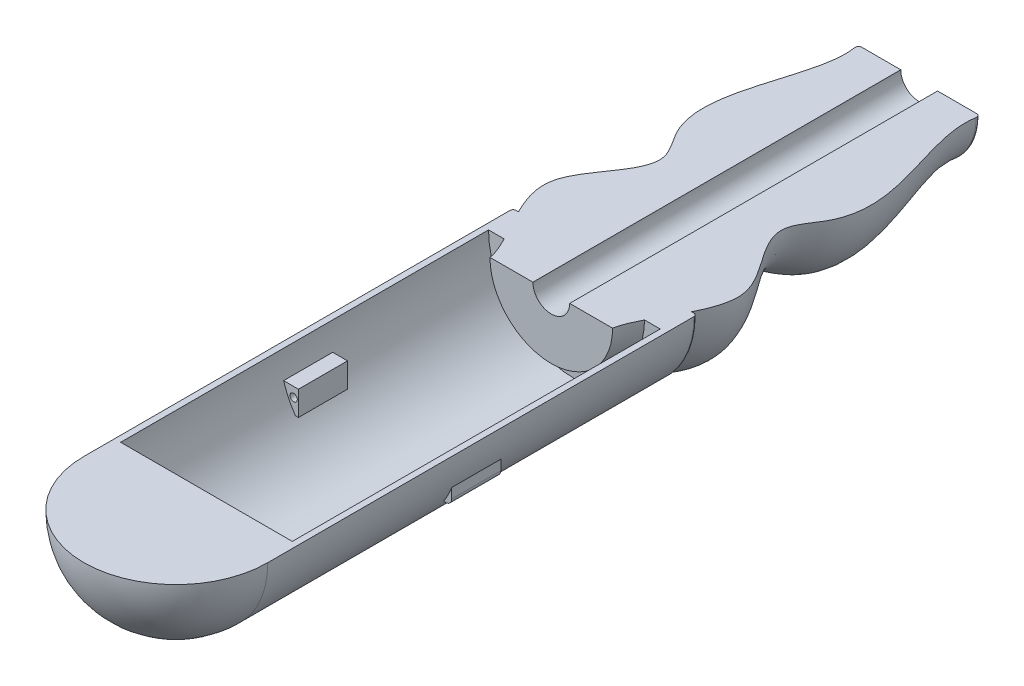
ISO-10303-21;
HEADER;
FILE_DESCRIPTION(('STEP AP214'),'2;1');
FILE_NAME('part.step','',(''),(''),'','','');
FILE_SCHEMA(('AUTOMOTIVE_DESIGN { 1 0 10303 214 1 1 1 1 }'));
ENDSEC;
DATA;
#1=APPLICATION_CONTEXT('core data for automotive mechanical design processes');
#2=APPLICATION_PROTOCOL_DEFINITION('international standard','automotive_design',2000,#1);
#3=PRODUCT_CONTEXT('',#1,'mechanical');
#4=PRODUCT('Part','Part','',(#3));
#5=PRODUCT_RELATED_PRODUCT_CATEGORY('part','',(#4));
#6=PRODUCT_DEFINITION_FORMATION('','',#4);
#7=PRODUCT_DEFINITION_CONTEXT('part definition',#1,'design');
#8=PRODUCT_DEFINITION('design','',#6,#7);
#9=PRODUCT_DEFINITION_SHAPE('','',#8);
#10=(LENGTH_UNIT() NAMED_UNIT(*) SI_UNIT(.MILLI.,.METRE.));
#11=(NAMED_UNIT(*) PLANE_ANGLE_UNIT() SI_UNIT($,.RADIAN.));
#12=(NAMED_UNIT(*) SI_UNIT($,.STERADIAN.) SOLID_ANGLE_UNIT());
#13=UNCERTAINTY_MEASURE_WITH_UNIT(LENGTH_MEASURE(1.E-05),#10,'distance_accuracy_value','');
#14=(GEOMETRIC_REPRESENTATION_CONTEXT(3) GLOBAL_UNCERTAINTY_ASSIGNED_CONTEXT((#13)) GLOBAL_UNIT_ASSIGNED_CONTEXT((#10,
#11,#12)) REPRESENTATION_CONTEXT('',''));
#15=CARTESIAN_POINT('',(0.,0.,0.));
#16=DIRECTION('',(0.,0.,1.));
#17=DIRECTION('',(1.,0.,0.));
#18=AXIS2_PLACEMENT_3D('',#15,#16,#17);
#19=CARTESIAN_POINT('',(33.02,-17.78,0.));
#20=DIRECTION('',(0.,0.,-1.));
#21=DIRECTION('',(-1.,0.,0.));
#22=AXIS2_PLACEMENT_3D('',#19,#20,#21);
#23=CYLINDRICAL_SURFACE('',#22,2.54);
#24=DIRECTION('',(0.,0.,-1.));
#25=VECTOR('',#24,1.);
#26=CARTESIAN_POINT('',(35.56,-17.78,0.));
#27=LINE('',#26,#25);
#28=CARTESIAN_POINT('',(35.56,-17.78,99.06));
#29=VERTEX_POINT('',#28);
#30=CARTESIAN_POINT('',(35.56,-17.78,78.74));
#31=VERTEX_POINT('',#30);
#32=EDGE_CURVE('E443',#29,#31,#27,.T.);
#33=ORIENTED_EDGE('',*,*,#32,.F.);
#34=CARTESIAN_POINT('',(33.02,-17.78,99.06));
#35=DIRECTION('',(0.,0.,-1.));
#36=DIRECTION('',(-1.,0.,0.));
#37=AXIS2_PLACEMENT_3D('',#34,#35,#36);
#38=CIRCLE('',#37,2.54);
#39=CARTESIAN_POINT('',(33.02,-20.32,99.06));
#40=VERTEX_POINT('',#39);
#41=EDGE_CURVE('E41',#40,#29,#38,.F.);
#42=ORIENTED_EDGE('',*,*,#41,.F.);
#43=DIRECTION('',(0.,0.,-1.));
#44=VECTOR('',#43,1.);
#45=CARTESIAN_POINT('',(33.02,-20.32,78.74));
#46=LINE('',#45,#44);
#47=CARTESIAN_POINT('',(33.02,-20.32,78.74));
#48=VERTEX_POINT('',#47);
#49=EDGE_CURVE('E447',#48,#40,#46,.F.);
#50=ORIENTED_EDGE('',*,*,#49,.F.);
#51=CARTESIAN_POINT('',(33.02,-17.78,78.74));
#52=DIRECTION('',(0.,0.,1.));
#53=DIRECTION('',(1.,0.,0.));
#54=AXIS2_PLACEMENT_3D('',#51,#52,#53);
#55=CIRCLE('',#54,2.54);
#56=EDGE_CURVE('E11',#31,#48,#55,.F.);
#57=ORIENTED_EDGE('',*,*,#56,.F.);
#58=EDGE_LOOP('',(#33,#42,#50,#57));
#59=FACE_BOUND('',#58,.T.);
#60=ADVANCED_FACE('F33',(#59),#23,.T.);
#61=CARTESIAN_POINT('',(0.,0.,165.1));
#62=DIRECTION('',(0.,0.,-1.));
#63=DIRECTION('',(-1.,0.,0.));
#64=AXIS2_PLACEMENT_3D('',#61,#62,#63);
#65=CYLINDRICAL_SURFACE('',#64,35.56);
#66=CARTESIAN_POINT('',(0.,0.,99.06));
#67=DIRECTION('',(0.,0.,-1.));
#68=DIRECTION('',(-1.,0.,0.));
#69=AXIS2_PLACEMENT_3D('',#66,#67,#68);
#70=CIRCLE('',#69,35.56);
#71=CARTESIAN_POINT('',(-34.0776759770968,-10.16,99.06));
#72=VERTEX_POINT('',#71);
#73=CARTESIAN_POINT('',(-29.1823782444132,-20.32,99.06));
#74=VERTEX_POINT('',#73);
#75=EDGE_CURVE('E305',#72,#74,#70,.F.);
#76=ORIENTED_EDGE('',*,*,#75,.F.);
#77=DIRECTION('',(0.,0.,-1.));
#78=VECTOR('',#77,1.);
#79=CARTESIAN_POINT('',(-34.0776759770968,-10.16,165.1));
#80=LINE('',#79,#78);
#81=CARTESIAN_POINT('',(-34.0776759770968,-10.16,78.74));
#82=VERTEX_POINT('',#81);
#83=EDGE_CURVE('E794',#82,#72,#80,.F.);
#84=ORIENTED_EDGE('',*,*,#83,.F.);
#85=CARTESIAN_POINT('',(0.,0.,78.74));
#86=DIRECTION('',(0.,0.,1.));
#87=DIRECTION('',(1.,0.,0.));
#88=AXIS2_PLACEMENT_3D('',#85,#86,#87);
#89=CIRCLE('',#88,35.56);
#90=CARTESIAN_POINT('',(-29.1823782444132,-20.32,78.74));
#91=VERTEX_POINT('',#90);
#92=EDGE_CURVE('E299',#91,#82,#89,.F.);
#93=ORIENTED_EDGE('',*,*,#92,.F.);
#94=DIRECTION('',(0.,0.,-1.));
#95=VECTOR('',#94,1.);
#96=CARTESIAN_POINT('',(-29.1823782444132,-20.32,165.1));
#97=LINE('',#96,#95);
#98=EDGE_CURVE('E302',#74,#91,#97,.T.);
#99=ORIENTED_EDGE('',*,*,#98,.F.);
#100=EDGE_LOOP('',(#76,#84,#93,#99));
#101=FACE_BOUND('',#100,.T.);
#102=DIRECTION('',(0.,0.,-1.));
#103=VECTOR('',#102,1.);
#104=CARTESIAN_POINT('',(35.56,0.,165.1));
#105=LINE('',#104,#103);
#106=CARTESIAN_POINT('',(35.56,0.,12.7));
#107=VERTEX_POINT('',#106);
#108=CARTESIAN_POINT('',(35.56,0.,165.1));
#109=VERTEX_POINT('',#108);
#110=EDGE_CURVE('E354',#107,#109,#105,.F.);
#111=ORIENTED_EDGE('',*,*,#110,.F.);
#112=CARTESIAN_POINT('',(0.,0.,12.7));
#113=DIRECTION('',(0.,0.,-1.));
#114=DIRECTION('',(-1.,0.,0.));
#115=AXIS2_PLACEMENT_3D('',#112,#113,#114);
#116=CIRCLE('',#115,35.56);
#117=CARTESIAN_POINT('',(-35.56,0.,12.7));
#118=VERTEX_POINT('',#117);
#119=EDGE_CURVE('E828',#107,#118,#116,.T.);
#120=ORIENTED_EDGE('',*,*,#119,.T.);
#121=DIRECTION('',(0.,0.,-1.));
#122=VECTOR('',#121,1.);
#123=CARTESIAN_POINT('',(-35.56,0.,165.1));
#124=LINE('',#123,#122);
#125=CARTESIAN_POINT('',(-35.56,0.,165.1));
#126=VERTEX_POINT('',#125);
#127=EDGE_CURVE('E341',#126,#118,#124,.T.);
#128=ORIENTED_EDGE('',*,*,#127,.F.);
#129=CARTESIAN_POINT('',(0.,0.,165.1));
#130=DIRECTION('',(0.,0.,-1.));
#131=DIRECTION('',(-1.,0.,0.));
#132=AXIS2_PLACEMENT_3D('',#129,#130,#131);
#133=CIRCLE('',#132,35.56);
#134=EDGE_CURVE('E822',#109,#126,#133,.T.);
#135=ORIENTED_EDGE('',*,*,#134,.F.);
#136=EDGE_LOOP('',(#111,#120,#128,#135));
#137=FACE_BOUND('',#136,.T.);
#138=DIRECTION('',(0.,0.,-1.));
#139=VECTOR('',#138,1.);
#140=CARTESIAN_POINT('',(34.0776759770968,-10.16,165.1));
#141=LINE('',#140,#139);
#142=CARTESIAN_POINT('',(34.0776759770968,-10.16,99.06));
#143=VERTEX_POINT('',#142);
#144=CARTESIAN_POINT('',(34.0776759770968,-10.16,78.74));
#145=VERTEX_POINT('',#144);
#146=EDGE_CURVE('E232',#143,#145,#141,.T.);
#147=ORIENTED_EDGE('',*,*,#146,.F.);
#148=CARTESIAN_POINT('',(0.,0.,99.06));
#149=DIRECTION('',(0.,0.,-1.));
#150=DIRECTION('',(-1.,0.,0.));
#151=AXIS2_PLACEMENT_3D('',#148,#149,#150);
#152=CIRCLE('',#151,35.56);
#153=CARTESIAN_POINT('',(29.1823782444132,-20.32,99.06));
#154=VERTEX_POINT('',#153);
#155=EDGE_CURVE('E235',#154,#143,#152,.F.);
#156=ORIENTED_EDGE('',*,*,#155,.F.);
#157=DIRECTION('',(0.,0.,-1.));
#158=VECTOR('',#157,1.);
#159=CARTESIAN_POINT('',(29.1823782444132,-20.32,165.1));
#160=LINE('',#159,#158);
#161=CARTESIAN_POINT('',(29.1823782444132,-20.32,78.74));
#162=VERTEX_POINT('',#161);
#163=EDGE_CURVE('E260',#162,#154,#160,.F.);
#164=ORIENTED_EDGE('',*,*,#163,.F.);
#165=CARTESIAN_POINT('',(0.,0.,78.74));
#166=DIRECTION('',(0.,0.,1.));
#167=DIRECTION('',(1.,0.,0.));
#168=AXIS2_PLACEMENT_3D('',#165,#166,#167);
#169=CIRCLE('',#168,35.56);
#170=EDGE_CURVE('E263',#145,#162,#169,.F.);
#171=ORIENTED_EDGE('',*,*,#170,.F.);
#172=EDGE_LOOP('',(#147,#156,#164,#171));
#173=FACE_BOUND('',#172,.T.);
#174=ADVANCED_FACE('F411',(#101,#137,#173),#65,.F.);
#175=CARTESIAN_POINT('',(0.,0.,177.8));
#176=DIRECTION('',(0.,0.,-1.));
#177=DIRECTION('',(-1.,0.,0.));
#178=AXIS2_PLACEMENT_3D('',#175,#176,#177);
#179=CYLINDRICAL_SURFACE('',#178,38.1);
#180=CARTESIAN_POINT('',(0.,0.,99.06));
#181=DIRECTION('',(0.,0.,-1.));
#182=DIRECTION('',(-1.,0.,0.));
#183=AXIS2_PLACEMENT_3D('',#180,#181,#182);
#184=CIRCLE('',#183,38.1);
#185=CARTESIAN_POINT('',(-32.2289869527418,-20.32,99.06));
#186=VERTEX_POINT('',#185);
#187=CARTESIAN_POINT('',(-35.56,-13.6783186101217,99.06));
#188=VERTEX_POINT('',#187);
#189=EDGE_CURVE('E791',#186,#188,#184,.T.);
#190=ORIENTED_EDGE('',*,*,#189,.F.);
#191=DIRECTION('',(0.,0.,-1.));
#192=VECTOR('',#191,1.);
#193=CARTESIAN_POINT('',(-32.2289869527418,-20.32,177.8));
#194=LINE('',#193,#192);
#195=CARTESIAN_POINT('',(-32.2289869527418,-20.32,78.74));
#196=VERTEX_POINT('',#195);
#197=EDGE_CURVE('E788',#196,#186,#194,.F.);
#198=ORIENTED_EDGE('',*,*,#197,.F.);
#199=CARTESIAN_POINT('',(0.,0.,78.74));
#200=DIRECTION('',(0.,0.,1.));
#201=DIRECTION('',(1.,0.,0.));
#202=AXIS2_PLACEMENT_3D('',#199,#200,#201);
#203=CIRCLE('',#202,38.1);
#204=CARTESIAN_POINT('',(-35.56,-13.6783186101217,78.74));
#205=VERTEX_POINT('',#204);
#206=EDGE_CURVE('E785',#205,#196,#203,.T.);
#207=ORIENTED_EDGE('',*,*,#206,.F.);
#208=DIRECTION('',(0.,0.,-1.));
#209=VECTOR('',#208,1.);
#210=CARTESIAN_POINT('',(-35.56,-13.6783186101217,177.8));
#211=LINE('',#210,#209);
#212=EDGE_CURVE('E778',#188,#205,#211,.T.);
#213=ORIENTED_EDGE('',*,*,#212,.F.);
#214=EDGE_LOOP('',(#190,#198,#207,#213));
#215=FACE_BOUND('',#214,.T.);
#216=DIRECTION('',(0.,0.,-1.));
#217=VECTOR('',#216,1.);
#218=CARTESIAN_POINT('',(38.1,0.,177.8));
#219=LINE('',#218,#217);
#220=CARTESIAN_POINT('',(38.1,0.,177.8));
#221=VERTEX_POINT('',#220);
#222=CARTESIAN_POINT('',(38.1,0.,1.26999999999999));
#223=VERTEX_POINT('',#222);
#224=EDGE_CURVE('E346',#221,#223,#219,.T.);
#225=ORIENTED_EDGE('',*,*,#224,.F.);
#226=CARTESIAN_POINT('',(0.,0.,177.8));
#227=DIRECTION('',(0.,0.,1.));
#228=DIRECTION('',(1.,0.,0.));
#229=AXIS2_PLACEMENT_3D('',#226,#227,#228);
#230=CIRCLE('',#229,38.1);
#231=CARTESIAN_POINT('',(-38.1,0.,177.8));
#232=VERTEX_POINT('',#231);
#233=EDGE_CURVE('E818',#232,#221,#230,.T.);
#234=ORIENTED_EDGE('',*,*,#233,.F.);
#235=DIRECTION('',(0.,0.,-1.));
#236=VECTOR('',#235,1.);
#237=CARTESIAN_POINT('',(-38.1,0.,177.8));
#238=LINE('',#237,#236);
#239=CARTESIAN_POINT('',(-38.1,0.,1.26999999999999));
#240=VERTEX_POINT('',#239);
#241=EDGE_CURVE('E338',#240,#232,#238,.F.);
#242=ORIENTED_EDGE('',*,*,#241,.F.);
#243=CARTESIAN_POINT('',(0.,0.,1.26999999999999));
#244=DIRECTION('',(0.,0.,1.));
#245=DIRECTION('',(1.,0.,0.));
#246=AXIS2_PLACEMENT_3D('',#243,#244,#245);
#247=CIRCLE('',#246,38.1);
#248=EDGE_CURVE('E820',#240,#223,#247,.T.);
#249=ORIENTED_EDGE('',*,*,#248,.T.);
#250=EDGE_LOOP('',(#225,#234,#242,#249));
#251=FACE_BOUND('',#250,.T.);
#252=CARTESIAN_POINT('',(0.,0.,78.74));
#253=DIRECTION('',(0.,0.,1.));
#254=DIRECTION('',(1.,0.,0.));
#255=AXIS2_PLACEMENT_3D('',#252,#253,#254);
#256=CIRCLE('',#255,38.1);
#257=CARTESIAN_POINT('',(32.2289869527418,-20.32,78.74));
#258=VERTEX_POINT('',#257);
#259=CARTESIAN_POINT('',(35.56,-13.6783186101217,78.74));
#260=VERTEX_POINT('',#259);
#261=EDGE_CURVE('E464',#258,#260,#256,.T.);
#262=ORIENTED_EDGE('',*,*,#261,.F.);
#263=DIRECTION('',(0.,0.,-1.));
#264=VECTOR('',#263,1.);
#265=CARTESIAN_POINT('',(32.2289869527418,-20.32,177.8));
#266=LINE('',#265,#264);
#267=CARTESIAN_POINT('',(32.2289869527418,-20.32,99.06));
#268=VERTEX_POINT('',#267);
#269=EDGE_CURVE('E462',#268,#258,#266,.T.);
#270=ORIENTED_EDGE('',*,*,#269,.F.);
#271=CARTESIAN_POINT('',(0.,0.,99.06));
#272=DIRECTION('',(0.,0.,-1.));
#273=DIRECTION('',(-1.,0.,0.));
#274=AXIS2_PLACEMENT_3D('',#271,#272,#273);
#275=CIRCLE('',#274,38.1);
#276=CARTESIAN_POINT('',(35.56,-13.6783186101217,99.06));
#277=VERTEX_POINT('',#276);
#278=EDGE_CURVE('E457',#277,#268,#275,.T.);
#279=ORIENTED_EDGE('',*,*,#278,.F.);
#280=DIRECTION('',(0.,0.,-1.));
#281=VECTOR('',#280,1.);
#282=CARTESIAN_POINT('',(35.56,-13.6783186101217,177.8));
#283=LINE('',#282,#281);
#284=EDGE_CURVE('E451',#260,#277,#283,.F.);
#285=ORIENTED_EDGE('',*,*,#284,.F.);
#286=EDGE_LOOP('',(#262,#270,#279,#285));
#287=FACE_BOUND('',#286,.T.);
#288=ADVANCED_FACE('F414',(#215,#251,#287),#179,.T.);
#289=CARTESIAN_POINT('',(-33.02,-17.78,0.));
#290=DIRECTION('',(0.,0.,1.));
#291=DIRECTION('',(1.,0.,0.));
#292=AXIS2_PLACEMENT_3D('',#289,#290,#291);
#293=CYLINDRICAL_SURFACE('',#292,2.54);
#294=DIRECTION('',(0.,0.,1.));
#295=VECTOR('',#294,1.);
#296=CARTESIAN_POINT('',(-35.56,-17.78,0.));
#297=LINE('',#296,#295);
#298=CARTESIAN_POINT('',(-35.56,-17.78,78.74));
#299=VERTEX_POINT('',#298);
#300=CARTESIAN_POINT('',(-35.56,-17.78,99.06));
#301=VERTEX_POINT('',#300);
#302=EDGE_CURVE('E797',#299,#301,#297,.T.);
#303=ORIENTED_EDGE('',*,*,#302,.F.);
#304=CARTESIAN_POINT('',(-33.02,-17.78,78.74));
#305=DIRECTION('',(0.,0.,1.));
#306=DIRECTION('',(1.,0.,0.));
#307=AXIS2_PLACEMENT_3D('',#304,#305,#306);
#308=CIRCLE('',#307,2.54);
#309=CARTESIAN_POINT('',(-33.02,-20.32,78.74));
#310=VERTEX_POINT('',#309);
#311=EDGE_CURVE('E803',#310,#299,#308,.F.);
#312=ORIENTED_EDGE('',*,*,#311,.F.);
#313=DIRECTION('',(0.,0.,1.));
#314=VECTOR('',#313,1.);
#315=CARTESIAN_POINT('',(-33.02,-20.32,99.06));
#316=LINE('',#315,#314);
#317=CARTESIAN_POINT('',(-33.02,-20.32,99.06));
#318=VERTEX_POINT('',#317);
#319=EDGE_CURVE('E800',#318,#310,#316,.F.);
#320=ORIENTED_EDGE('',*,*,#319,.F.);
#321=CARTESIAN_POINT('',(-33.02,-17.78,99.06));
#322=DIRECTION('',(0.,0.,-1.));
#323=DIRECTION('',(-1.,0.,0.));
#324=AXIS2_PLACEMENT_3D('',#321,#322,#323);
#325=CIRCLE('',#324,2.54);
#326=EDGE_CURVE('E466',#301,#318,#325,.F.);
#327=ORIENTED_EDGE('',*,*,#326,.F.);
#328=EDGE_LOOP('',(#303,#312,#320,#327));
#329=FACE_BOUND('',#328,.T.);
#330=ADVANCED_FACE('F409',(#329),#293,.T.);
#331=CARTESIAN_POINT('',(0.,0.,12.7));
#332=DIRECTION('',(0.,0.,-1.));
#333=DIRECTION('',(-1.,0.,0.));
#334=AXIS2_PLACEMENT_3D('',#331,#332,#333);
#335=PLANE('',#334);
#336=DIRECTION('',(1.,0.,0.));
#337=VECTOR('',#336,1.);
#338=CARTESIAN_POINT('',(0.,0.,12.7));
#339=LINE('',#338,#337);
#340=CARTESIAN_POINT('',(-29.0545403848062,0.,12.7));
#341=VERTEX_POINT('',#340);
#342=EDGE_CURVE('E333',#118,#341,#339,.T.);
#343=ORIENTED_EDGE('',*,*,#342,.F.);
#344=ORIENTED_EDGE('',*,*,#119,.F.);
#345=CARTESIAN_POINT('',(29.0545403848062,0.,12.7));
#346=VERTEX_POINT('',#345);
#347=EDGE_CURVE('E339',#346,#107,#339,.T.);
#348=ORIENTED_EDGE('',*,*,#347,.F.);
#349=CARTESIAN_POINT('',(0.,0.,12.7));
#350=DIRECTION('',(0.,0.,1.));
#351=DIRECTION('',(1.,0.,0.));
#352=AXIS2_PLACEMENT_3D('',#349,#350,#351);
#353=CIRCLE('',#352,29.0545403848062);
#354=EDGE_CURVE('E821',#341,#346,#353,.T.);
#355=ORIENTED_EDGE('',*,*,#354,.F.);
#356=EDGE_LOOP('',(#343,#344,#348,#355));
#357=FACE_BOUND('',#356,.T.);
#358=ADVANCED_FACE('F405',(#357),#335,.F.);
#359=CARTESIAN_POINT('',(0.,0.,165.1));
#360=DIRECTION('',(0.,0.,-1.));
#361=DIRECTION('',(-1.,0.,0.));
#362=AXIS2_PLACEMENT_3D('',#359,#360,#361);
#363=PLANE('',#362);
#364=ORIENTED_EDGE('',*,*,#134,.T.);
#365=DIRECTION('',(1.,0.,0.));
#366=VECTOR('',#365,1.);
#367=CARTESIAN_POINT('',(0.,0.,165.1));
#368=LINE('',#367,#366);
#369=EDGE_CURVE('E351',#126,#109,#368,.T.);
#370=ORIENTED_EDGE('',*,*,#369,.T.);
#371=EDGE_LOOP('',(#364,#370));
#372=FACE_BOUND('',#371,.T.);
#373=ADVANCED_FACE('F401',(#372),#363,.T.);
#374=CARTESIAN_POINT('',(0.,0.,22.2659516980741));
#375=DIRECTION('',(0.,0.,-1.));
#376=DIRECTION('',(-1.,0.,0.));
#377=AXIS2_PLACEMENT_3D('',#374,#375,#376);
#378=PLANE('',#377);
#379=DIRECTION('',(1.,0.,0.));
#380=VECTOR('',#379,1.);
#381=CARTESIAN_POINT('',(0.,0.,22.2659516980741));
#382=LINE('',#381,#380);
#383=CARTESIAN_POINT('',(-25.4,0.,22.2659516980741));
#384=VERTEX_POINT('',#383);
#385=CARTESIAN_POINT('',(-7.62,0.,22.2659516980741));
#386=VERTEX_POINT('',#385);
#387=EDGE_CURVE('E313',#384,#386,#382,.T.);
#388=ORIENTED_EDGE('',*,*,#387,.F.);
#389=CARTESIAN_POINT('',(0.,0.,22.2659516980741));
#390=DIRECTION('',(0.,0.,1.));
#391=DIRECTION('',(1.,0.,0.));
#392=AXIS2_PLACEMENT_3D('',#389,#390,#391);
#393=CIRCLE('',#392,25.4);
#394=CARTESIAN_POINT('',(25.4,0.,22.2659516980741));
#395=VERTEX_POINT('',#394);
#396=EDGE_CURVE('E383',#384,#395,#393,.T.);
#397=ORIENTED_EDGE('',*,*,#396,.T.);
#398=CARTESIAN_POINT('',(7.62,0.,22.2659516980741));
#399=VERTEX_POINT('',#398);
#400=EDGE_CURVE('E316',#399,#395,#382,.T.);
#401=ORIENTED_EDGE('',*,*,#400,.F.);
#402=CARTESIAN_POINT('',(0.,0.,22.2659516980741));
#403=DIRECTION('',(0.,0.,-1.));
#404=DIRECTION('',(-1.,0.,0.));
#405=AXIS2_PLACEMENT_3D('',#402,#403,#404);
#406=CIRCLE('',#405,7.62);
#407=EDGE_CURVE('E378',#399,#386,#406,.T.);
#408=ORIENTED_EDGE('',*,*,#407,.T.);
#409=EDGE_LOOP('',(#388,#397,#401,#408));
#410=FACE_BOUND('',#409,.T.);
#411=ADVANCED_FACE('F394',(#410),#378,.F.);
#412=CARTESIAN_POINT('',(25.4,0.,-130.134048301926));
#413=CARTESIAN_POINT('',(20.8841596485698,0.,-111.244612937001));
#414=CARTESIAN_POINT('',(46.9742504639721,0.,-77.0990514843062));
#415=CARTESIAN_POINT('',(21.1259712149526,0.,-47.8683443387256));
#416=CARTESIAN_POINT('',(32.8781656152221,0.,-32.2091686901714));
#417=CARTESIAN_POINT('',(47.2653101550789,0.,-9.69853689332056));
#418=CARTESIAN_POINT('',(27.2094742152726,0.,11.4358863906253));
#419=CARTESIAN_POINT('',(25.4,0.,22.2659516980741));
#420=B_SPLINE_CURVE_WITH_KNOTS('',3,(#412,#413,#414,#415,#416,#417,#418,#419),.UNSPECIFIED.,.F.,
.F.,(4,1,1,1,1,4),(0.,0.434044073682287,0.516475295632558,0.640393496553591,0.738673240612466,
1.),.UNSPECIFIED.);
#421=CARTESIAN_POINT('',(0.,0.,22.2659516980741));
#422=DIRECTION('',(0.,0.,1.));
#423=AXIS1_PLACEMENT('',#421,#422);
#424=SURFACE_OF_REVOLUTION('',#420,#423);
#425=CARTESIAN_POINT('',(-25.4,0.,-130.134048301926));
#426=CARTESIAN_POINT('',(-20.8841596485698,0.,-111.244612937001));
#427=CARTESIAN_POINT('',(-46.9742504639721,0.,-77.0990514843062));
#428=CARTESIAN_POINT('',(-21.1259712149526,0.,-47.8683443387256));
#429=CARTESIAN_POINT('',(-32.8781656152221,0.,-32.2091686901714));
#430=CARTESIAN_POINT('',(-47.2653101550789,0.,-9.69853689332056));
#431=CARTESIAN_POINT('',(-27.2094742152726,0.,11.4358863906253));
#432=CARTESIAN_POINT('',(-25.4,0.,22.2659516980741));
#433=B_SPLINE_CURVE_WITH_KNOTS('',3,(#425,#426,#427,#428,#429,#430,#431,#432),.UNSPECIFIED.,.F.,
.F.,(4,1,1,1,1,4),(0.,0.434044073682287,0.516475295632558,0.640393496553591,0.738673240612466,
1.),.UNSPECIFIED.);
#434=EDGE_CURVE('E329',#341,#384,#433,.T.);
#435=ORIENTED_EDGE('',*,*,#434,.F.);
#436=ORIENTED_EDGE('',*,*,#354,.T.);
#437=CARTESIAN_POINT('',(25.4,0.,-130.134048301926));
#438=CARTESIAN_POINT('',(20.8841596485698,0.,-111.244612937001));
#439=CARTESIAN_POINT('',(46.9742504639721,0.,-77.0990514843062));
#440=CARTESIAN_POINT('',(21.1259712149526,0.,-47.8683443387256));
#441=CARTESIAN_POINT('',(32.8781656152221,0.,-32.2091686901714));
#442=CARTESIAN_POINT('',(47.2653101550789,0.,-9.69853689332056));
#443=CARTESIAN_POINT('',(27.2094742152726,0.,11.4358863906253));
#444=CARTESIAN_POINT('',(25.4,0.,22.2659516980741));
#445=B_SPLINE_CURVE_WITH_KNOTS('',3,(#437,#438,#439,#440,#441,#442,#443,#444),.UNSPECIFIED.,.F.,
.F.,(4,1,1,1,1,4),(0.,0.434044073682287,0.516475295632558,0.640393496553591,0.738673240612466,
1.),.UNSPECIFIED.);
#446=EDGE_CURVE('E356',#395,#346,#445,.F.);
#447=ORIENTED_EDGE('',*,*,#446,.F.);
#448=ORIENTED_EDGE('',*,*,#396,.F.);
#449=EDGE_LOOP('',(#435,#436,#447,#448));
#450=FACE_BOUND('',#449,.T.);
#451=ADVANCED_FACE('F389',(#450),#424,.T.);
#452=CARTESIAN_POINT('',(0.,0.,34.9659516980741));
#453=DIRECTION('',(0.,0.,-1.));
#454=DIRECTION('',(-1.,0.,0.));
#455=AXIS2_PLACEMENT_3D('',#452,#453,#454);
#456=CYLINDRICAL_SURFACE('',#455,7.62);
#457=DIRECTION('',(0.,0.,-1.));
#458=VECTOR('',#457,1.);
#459=CARTESIAN_POINT('',(7.62,0.,34.9659516980741));
#460=LINE('',#459,#458);
#461=CARTESIAN_POINT('',(7.62,0.,-130.134048301926));
#462=VERTEX_POINT('',#461);
#463=EDGE_CURVE('E373',#462,#399,#460,.F.);
#464=ORIENTED_EDGE('',*,*,#463,.F.);
#465=CARTESIAN_POINT('',(0.,0.,-130.134048301926));
#466=DIRECTION('',(0.,0.,-1.));
#467=DIRECTION('',(-1.,0.,0.));
#468=AXIS2_PLACEMENT_3D('',#465,#466,#467);
#469=CIRCLE('',#468,7.62);
#470=CARTESIAN_POINT('',(-7.62,0.,-130.134048301926));
#471=VERTEX_POINT('',#470);
#472=EDGE_CURVE('E375',#462,#471,#469,.T.);
#473=ORIENTED_EDGE('',*,*,#472,.T.);
#474=DIRECTION('',(0.,0.,-1.));
#475=VECTOR('',#474,1.);
#476=CARTESIAN_POINT('',(-7.62,0.,34.9659516980741));
#477=LINE('',#476,#475);
#478=EDGE_CURVE('E311',#386,#471,#477,.T.);
#479=ORIENTED_EDGE('',*,*,#478,.F.);
#480=ORIENTED_EDGE('',*,*,#407,.F.);
#481=EDGE_LOOP('',(#464,#473,#479,#480));
#482=FACE_BOUND('',#481,.T.);
#483=ADVANCED_FACE('F393',(#482),#456,.F.);
#484=CARTESIAN_POINT('',(0.,0.,-128.864048301926));
#485=DIRECTION('',(0.,0.,1.));
#486=DIRECTION('',(1.,0.,0.));
#487=AXIS2_PLACEMENT_3D('',#484,#485,#486);
#488=TOROIDAL_SURFACE('',#487,23.8499489842391,1.27);
#489=CARTESIAN_POINT('',(0.,0.,-128.657477402413));
#490=DIRECTION('',(0.,0.,1.));
#491=DIRECTION('',(1.,0.,0.));
#492=AXIS2_PLACEMENT_3D('',#489,#490,#491);
#493=CIRCLE('',#492,25.1030365563882);
#494=CARTESIAN_POINT('',(-25.1030365563882,0.,-128.657477402413));
#495=VERTEX_POINT('',#494);
#496=CARTESIAN_POINT('',(25.103036556388,0.,-128.657477402412));
#497=VERTEX_POINT('',#496);
#498=EDGE_CURVE('E779',#495,#497,#493,.T.);
#499=ORIENTED_EDGE('',*,*,#498,.F.);
#500=CARTESIAN_POINT('',(-23.8499489842391,0.,-128.864048301926));
#501=DIRECTION('',(0.,1.,0.));
#502=DIRECTION('',(0.,0.,1.));
#503=AXIS2_PLACEMENT_3D('',#500,#501,#502);
#504=CIRCLE('',#503,1.27);
#505=CARTESIAN_POINT('',(-23.8499489842391,0.,-130.134048301926));
#506=VERTEX_POINT('',#505);
#507=EDGE_CURVE('E308',#495,#506,#504,.F.);
#508=ORIENTED_EDGE('',*,*,#507,.T.);
#509=CARTESIAN_POINT('',(0.,0.,-130.134048301926));
#510=DIRECTION('',(0.,0.,1.));
#511=DIRECTION('',(1.,0.,0.));
#512=AXIS2_PLACEMENT_3D('',#509,#510,#511);
#513=CIRCLE('',#512,23.8499489842391);
#514=CARTESIAN_POINT('',(23.8499489842391,0.,-130.134048301926));
#515=VERTEX_POINT('',#514);
#516=EDGE_CURVE('E776',#515,#506,#513,.F.);
#517=ORIENTED_EDGE('',*,*,#516,.F.);
#518=CARTESIAN_POINT('',(23.8499489842391,0.,-128.864048301926));
#519=DIRECTION('',(0.,1.,0.));
#520=DIRECTION('',(0.,0.,1.));
#521=AXIS2_PLACEMENT_3D('',#518,#519,#520);
#522=CIRCLE('',#521,1.27);
#523=EDGE_CURVE('E367',#515,#497,#522,.F.);
#524=ORIENTED_EDGE('',*,*,#523,.T.);
#525=EDGE_LOOP('',(#499,#508,#517,#524));
#526=FACE_BOUND('',#525,.T.);
#527=ADVANCED_FACE('F430',(#526),#488,.T.);
#528=CARTESIAN_POINT('',(0.,0.,1.26999999999999));
#529=DIRECTION('',(0.,0.,1.));
#530=DIRECTION('',(1.,0.,0.));
#531=AXIS2_PLACEMENT_3D('',#528,#529,#530);
#532=TOROIDAL_SURFACE('',#531,36.83,1.27);
#533=ORIENTED_EDGE('',*,*,#248,.F.);
#534=CARTESIAN_POINT('',(-36.83,0.,1.26999999999999));
#535=DIRECTION('',(0.,1.,0.));
#536=DIRECTION('',(0.,0.,1.));
#537=AXIS2_PLACEMENT_3D('',#534,#535,#536);
#538=CIRCLE('',#537,1.27);
#539=CARTESIAN_POINT('',(-36.83,0.,0.));
#540=VERTEX_POINT('',#539);
#541=EDGE_CURVE('E325',#240,#540,#538,.F.);
#542=ORIENTED_EDGE('',*,*,#541,.T.);
#543=CARTESIAN_POINT('',(0.,0.,0.));
#544=DIRECTION('',(0.,0.,1.));
#545=DIRECTION('',(1.,0.,0.));
#546=AXIS2_PLACEMENT_3D('',#543,#544,#545);
#547=CIRCLE('',#546,36.83);
#548=CARTESIAN_POINT('',(36.83,0.,0.));
#549=VERTEX_POINT('',#548);
#550=EDGE_CURVE('E833',#549,#540,#547,.F.);
#551=ORIENTED_EDGE('',*,*,#550,.F.);
#552=CARTESIAN_POINT('',(36.83,0.,1.26999999999999));
#553=DIRECTION('',(0.,1.,0.));
#554=DIRECTION('',(0.,0.,1.));
#555=AXIS2_PLACEMENT_3D('',#552,#553,#554);
#556=CIRCLE('',#555,1.27);
#557=EDGE_CURVE('E348',#549,#223,#556,.F.);
#558=ORIENTED_EDGE('',*,*,#557,.T.);
#559=EDGE_LOOP('',(#533,#542,#551,#558));
#560=FACE_BOUND('',#559,.T.);
#561=ADVANCED_FACE('F423',(#560),#532,.T.);
#562=CARTESIAN_POINT('',(0.,0.,0.));
#563=DIRECTION('',(0.,0.,1.));
#564=DIRECTION('',(1.,0.,0.));
#565=AXIS2_PLACEMENT_3D('',#562,#563,#564);
#566=PLANE('',#565);
#567=DIRECTION('',(-1.,0.,0.));
#568=VECTOR('',#567,1.);
#569=CARTESIAN_POINT('',(0.,0.,0.));
#570=LINE('',#569,#568);
#571=CARTESIAN_POINT('',(35.8646232542679,0.,0.));
#572=VERTEX_POINT('',#571);
#573=EDGE_CURVE('E326',#549,#572,#570,.T.);
#574=ORIENTED_EDGE('',*,*,#573,.F.);
#575=ORIENTED_EDGE('',*,*,#550,.T.);
#576=CARTESIAN_POINT('',(-35.8646232542677,0.,3.21791204793698E-13));
#577=VERTEX_POINT('',#576);
#578=EDGE_CURVE('E320',#577,#540,#570,.T.);
#579=ORIENTED_EDGE('',*,*,#578,.F.);
#580=CARTESIAN_POINT('',(0.,0.,0.));
#581=DIRECTION('',(0.,0.,1.));
#582=DIRECTION('',(1.,0.,0.));
#583=AXIS2_PLACEMENT_3D('',#580,#581,#582);
#584=CIRCLE('',#583,35.8646232542679);
#585=EDGE_CURVE('E825',#572,#577,#584,.F.);
#586=ORIENTED_EDGE('',*,*,#585,.F.);
#587=EDGE_LOOP('',(#574,#575,#579,#586));
#588=FACE_BOUND('',#587,.T.);
#589=ADVANCED_FACE('F419',(#588),#566,.F.);
#590=CARTESIAN_POINT('',(0.,0.,177.8));
#591=DIRECTION('',(0.,1.,0.));
#592=DIRECTION('',(1.,0.,0.));
#593=AXIS2_PLACEMENT_3D('',#590,#591,#592);
#594=SPHERICAL_SURFACE('',#593,38.1);
#595=ORIENTED_EDGE('',*,*,#233,.T.);
#596=CARTESIAN_POINT('',(0.,0.,177.8));
#597=DIRECTION('',(0.,1.,0.));
#598=DIRECTION('',(0.,0.,1.));
#599=AXIS2_PLACEMENT_3D('',#596,#597,#598);
#600=CIRCLE('',#599,38.1);
#601=EDGE_CURVE('E343',#221,#232,#600,.F.);
#602=ORIENTED_EDGE('',*,*,#601,.T.);
#603=EDGE_LOOP('',(#595,#602));
#604=FACE_BOUND('',#603,.T.);
#605=ADVANCED_FACE('F416',(#604),#594,.T.);
#606=CARTESIAN_POINT('',(-25.4,0.,-130.134048301926));
#607=CARTESIAN_POINT('',(-20.8841596485698,0.,-111.244612937001));
#608=CARTESIAN_POINT('',(-46.9742504639721,0.,-77.0990514843062));
#609=CARTESIAN_POINT('',(-21.1259712149526,0.,-47.8683443387256));
#610=CARTESIAN_POINT('',(-32.8781656152221,0.,-32.2091686901714));
#611=CARTESIAN_POINT('',(-47.2653101550789,0.,-9.69853689332056));
#612=CARTESIAN_POINT('',(-27.2094742152726,0.,11.4358863906253));
#613=CARTESIAN_POINT('',(-25.4,0.,22.2659516980741));
#614=B_SPLINE_CURVE_WITH_KNOTS('',3,(#606,#607,#608,#609,#610,#611,#612,#613),.UNSPECIFIED.,.F.,
.F.,(4,1,1,1,1,4),(0.,0.434044073682287,0.516475295632558,0.640393496553591,0.738673240612466,
1.),.UNSPECIFIED.);
#615=EDGE_CURVE('E315',#495,#577,#614,.T.);
#616=ORIENTED_EDGE('',*,*,#615,.F.);
#617=ORIENTED_EDGE('',*,*,#498,.T.);
#618=CARTESIAN_POINT('',(25.4,0.,-130.134048301926));
#619=CARTESIAN_POINT('',(20.8841596485698,0.,-111.244612937001));
#620=CARTESIAN_POINT('',(46.9742504639721,0.,-77.0990514843062));
#621=CARTESIAN_POINT('',(21.1259712149526,0.,-47.8683443387256));
#622=CARTESIAN_POINT('',(32.8781656152221,0.,-32.2091686901714));
#623=CARTESIAN_POINT('',(47.2653101550789,0.,-9.69853689332056));
#624=CARTESIAN_POINT('',(27.2094742152726,0.,11.4358863906253));
#625=CARTESIAN_POINT('',(25.4,0.,22.2659516980741));
#626=B_SPLINE_CURVE_WITH_KNOTS('',3,(#618,#619,#620,#621,#622,#623,#624,#625),.UNSPECIFIED.,.F.,
.F.,(4,1,1,1,1,4),(0.,0.434044073682287,0.516475295632558,0.640393496553591,0.738673240612466,
1.),.UNSPECIFIED.);
#627=EDGE_CURVE('E360',#572,#497,#626,.F.);
#628=ORIENTED_EDGE('',*,*,#627,.F.);
#629=ORIENTED_EDGE('',*,*,#585,.T.);
#630=EDGE_LOOP('',(#616,#617,#628,#629));
#631=FACE_BOUND('',#630,.T.);
#632=ADVANCED_FACE('F396',(#631),#424,.T.);
#633=CARTESIAN_POINT('',(0.,0.,-130.134048301926));
#634=DIRECTION('',(0.,0.,1.));
#635=DIRECTION('',(1.,0.,0.));
#636=AXIS2_PLACEMENT_3D('',#633,#634,#635);
#637=PLANE('',#636);
#638=DIRECTION('',(-1.,0.,0.));
#639=VECTOR('',#638,1.);
#640=CARTESIAN_POINT('',(0.,0.,-130.134048301926));
#641=LINE('',#640,#639);
#642=EDGE_CURVE('E773',#515,#462,#641,.T.);
#643=ORIENTED_EDGE('',*,*,#642,.F.);
#644=ORIENTED_EDGE('',*,*,#516,.T.);
#645=EDGE_CURVE('E775',#471,#506,#641,.T.);
#646=ORIENTED_EDGE('',*,*,#645,.F.);
#647=ORIENTED_EDGE('',*,*,#472,.F.);
#648=EDGE_LOOP('',(#643,#644,#646,#647));
#649=FACE_BOUND('',#648,.T.);
#650=ADVANCED_FACE('F397',(#649),#637,.F.);
#651=CARTESIAN_POINT('',(0.,0.,0.));
#652=DIRECTION('',(0.,1.,0.));
#653=DIRECTION('',(0.,0.,1.));
#654=AXIS2_PLACEMENT_3D('',#651,#652,#653);
#655=PLANE('',#654);
#656=ORIENTED_EDGE('',*,*,#642,.T.);
#657=ORIENTED_EDGE('',*,*,#463,.T.);
#658=ORIENTED_EDGE('',*,*,#400,.T.);
#659=ORIENTED_EDGE('',*,*,#446,.T.);
#660=ORIENTED_EDGE('',*,*,#347,.T.);
#661=ORIENTED_EDGE('',*,*,#110,.T.);
#662=ORIENTED_EDGE('',*,*,#369,.F.);
#663=ORIENTED_EDGE('',*,*,#127,.T.);
#664=ORIENTED_EDGE('',*,*,#342,.T.);
#665=ORIENTED_EDGE('',*,*,#434,.T.);
#666=ORIENTED_EDGE('',*,*,#387,.T.);
#667=ORIENTED_EDGE('',*,*,#478,.T.);
#668=ORIENTED_EDGE('',*,*,#645,.T.);
#669=ORIENTED_EDGE('',*,*,#507,.F.);
#670=ORIENTED_EDGE('',*,*,#615,.T.);
#671=ORIENTED_EDGE('',*,*,#578,.T.);
#672=ORIENTED_EDGE('',*,*,#541,.F.);
#673=ORIENTED_EDGE('',*,*,#241,.T.);
#674=ORIENTED_EDGE('',*,*,#601,.F.);
#675=ORIENTED_EDGE('',*,*,#224,.T.);
#676=ORIENTED_EDGE('',*,*,#557,.F.);
#677=ORIENTED_EDGE('',*,*,#573,.T.);
#678=ORIENTED_EDGE('',*,*,#627,.T.);
#679=ORIENTED_EDGE('',*,*,#523,.F.);
#680=EDGE_LOOP('',(#656,#657,#658,#659,#660,#661,#662,#663,#664,#665,#666,#667,#668,#669,#670,
#671,#672,#673,#674,#675,#676,#677,#678,#679));
#681=FACE_BOUND('',#680,.T.);
#682=ADVANCED_FACE('F624',(#681),#655,.T.);
#683=CARTESIAN_POINT('',(-35.56,0.,0.));
#684=DIRECTION('',(1.,0.,0.));
#685=DIRECTION('',(0.,0.,-1.));
#686=AXIS2_PLACEMENT_3D('',#683,#684,#685);
#687=PLANE('',#686);
#688=DIRECTION('',(0.,1.,0.));
#689=VECTOR('',#688,1.);
#690=CARTESIAN_POINT('',(-35.56,-20.32,78.74));
#691=LINE('',#690,#689);
#692=EDGE_CURVE('E276',#299,#205,#691,.T.);
#693=ORIENTED_EDGE('',*,*,#692,.F.);
#694=ORIENTED_EDGE('',*,*,#302,.T.);
#695=DIRECTION('',(0.,-1.,0.));
#696=VECTOR('',#695,1.);
#697=CARTESIAN_POINT('',(-35.56,-10.16,99.06));
#698=LINE('',#697,#696);
#699=EDGE_CURVE('E271',#188,#301,#698,.T.);
#700=ORIENTED_EDGE('',*,*,#699,.F.);
#701=ORIENTED_EDGE('',*,*,#212,.T.);
#702=EDGE_LOOP('',(#693,#694,#700,#701));
#703=FACE_BOUND('',#702,.T.);
#704=ADVANCED_FACE('F614',(#703),#687,.F.);
#705=CARTESIAN_POINT('',(-27.94,-20.32,78.74));
#706=DIRECTION('',(0.,0.,1.));
#707=DIRECTION('',(1.,0.,0.));
#708=AXIS2_PLACEMENT_3D('',#705,#706,#707);
#709=PLANE('',#708);
#710=DIRECTION('',(-1.,0.,0.));
#711=VECTOR('',#710,1.);
#712=CARTESIAN_POINT('',(-27.94,-20.32,78.74));
#713=LINE('',#712,#711);
#714=EDGE_CURVE('E291',#196,#310,#713,.T.);
#715=ORIENTED_EDGE('',*,*,#714,.T.);
#716=ORIENTED_EDGE('',*,*,#311,.T.);
#717=ORIENTED_EDGE('',*,*,#692,.T.);
#718=ORIENTED_EDGE('',*,*,#206,.T.);
#719=EDGE_LOOP('',(#715,#716,#717,#718));
#720=FACE_BOUND('',#719,.T.);
#721=ADVANCED_FACE('F603',(#720),#709,.F.);
#722=CARTESIAN_POINT('',(-27.94,-20.32,99.06));
#723=DIRECTION('',(0.,1.,0.));
#724=DIRECTION('',(0.,0.,1.));
#725=AXIS2_PLACEMENT_3D('',#722,#723,#724);
#726=PLANE('',#725);
#727=DIRECTION('',(-1.,0.,0.));
#728=VECTOR('',#727,1.);
#729=CARTESIAN_POINT('',(-27.94,-20.32,99.06));
#730=LINE('',#729,#728);
#731=EDGE_CURVE('E295',#186,#318,#730,.T.);
#732=ORIENTED_EDGE('',*,*,#731,.T.);
#733=ORIENTED_EDGE('',*,*,#319,.T.);
#734=ORIENTED_EDGE('',*,*,#714,.F.);
#735=ORIENTED_EDGE('',*,*,#197,.T.);
#736=EDGE_LOOP('',(#732,#733,#734,#735));
#737=FACE_BOUND('',#736,.T.);
#738=ADVANCED_FACE('F590',(#737),#726,.F.);
#739=CARTESIAN_POINT('',(-27.94,-10.16,99.06));
#740=DIRECTION('',(0.,0.,-1.));
#741=DIRECTION('',(-1.,0.,0.));
#742=AXIS2_PLACEMENT_3D('',#739,#740,#741);
#743=PLANE('',#742);
#744=ORIENTED_EDGE('',*,*,#699,.T.);
#745=ORIENTED_EDGE('',*,*,#326,.T.);
#746=ORIENTED_EDGE('',*,*,#731,.F.);
#747=ORIENTED_EDGE('',*,*,#189,.T.);
#748=EDGE_LOOP('',(#744,#745,#746,#747));
#749=FACE_BOUND('',#748,.T.);
#750=ADVANCED_FACE('F584',(#749),#743,.F.);
#751=CARTESIAN_POINT('',(-27.94,-10.16,88.9));
#752=DIRECTION('',(0.,-1.,0.));
#753=DIRECTION('',(0.,0.,-1.));
#754=AXIS2_PLACEMENT_3D('',#751,#752,#753);
#755=PLANE('',#754);
#756=DIRECTION('',(-1.,0.,0.));
#757=VECTOR('',#756,1.);
#758=CARTESIAN_POINT('',(-27.94,-10.16,78.74));
#759=LINE('',#758,#757);
#760=CARTESIAN_POINT('',(-27.94,-10.16,78.74));
#761=VERTEX_POINT('',#760);
#762=EDGE_CURVE('E288',#761,#82,#759,.T.);
#763=ORIENTED_EDGE('',*,*,#762,.T.);
#764=ORIENTED_EDGE('',*,*,#83,.T.);
#765=DIRECTION('',(-1.,0.,0.));
#766=VECTOR('',#765,1.);
#767=CARTESIAN_POINT('',(-27.94,-10.16,99.06));
#768=LINE('',#767,#766);
#769=CARTESIAN_POINT('',(-27.94,-10.16,99.06));
#770=VERTEX_POINT('',#769);
#771=EDGE_CURVE('E282',#770,#72,#768,.T.);
#772=ORIENTED_EDGE('',*,*,#771,.F.);
#773=DIRECTION('',(0.,0.,1.));
#774=VECTOR('',#773,1.);
#775=CARTESIAN_POINT('',(-27.94,-10.16,78.74));
#776=LINE('',#775,#774);
#777=EDGE_CURVE('E280',#761,#770,#776,.T.);
#778=ORIENTED_EDGE('',*,*,#777,.F.);
#779=EDGE_LOOP('',(#763,#764,#772,#778));
#780=FACE_BOUND('',#779,.T.);
#781=ADVANCED_FACE('F589',(#780),#755,.F.);
#782=CARTESIAN_POINT('',(-29.9460400428941,-14.1635615445068,99.06));
#783=DIRECTION('',(0.,0.,-1.));
#784=DIRECTION('',(-1.,0.,0.));
#785=AXIS2_PLACEMENT_3D('',#782,#783,#784);
#786=CIRCLE('',#785,1.524);
#787=CARTESIAN_POINT('',(-31.4700400428941,-14.1635615445068,99.06));
#788=VERTEX_POINT('',#787);
#789=EDGE_CURVE('E268',#788,#788,#786,.T.);
#790=ORIENTED_EDGE('',*,*,#789,.T.);
#791=EDGE_LOOP('',(#790));
#792=FACE_BOUND('',#791,.T.);
#793=ORIENTED_EDGE('',*,*,#771,.T.);
#794=ORIENTED_EDGE('',*,*,#75,.T.);
#795=CARTESIAN_POINT('',(-27.94,-20.32,99.06));
#796=VERTEX_POINT('',#795);
#797=EDGE_CURVE('E296',#796,#74,#730,.T.);
#798=ORIENTED_EDGE('',*,*,#797,.F.);
#799=DIRECTION('',(0.,-1.,0.));
#800=VECTOR('',#799,1.);
#801=CARTESIAN_POINT('',(-27.94,-10.16,99.06));
#802=LINE('',#801,#800);
#803=EDGE_CURVE('E272',#770,#796,#802,.T.);
#804=ORIENTED_EDGE('',*,*,#803,.F.);
#805=EDGE_LOOP('',(#793,#794,#798,#804));
#806=FACE_BOUND('',#805,.T.);
#807=ADVANCED_FACE('F593',(#792,#806),#743,.F.);
#808=ORIENTED_EDGE('',*,*,#797,.T.);
#809=ORIENTED_EDGE('',*,*,#98,.T.);
#810=CARTESIAN_POINT('',(-27.94,-20.32,78.74));
#811=VERTEX_POINT('',#810);
#812=EDGE_CURVE('E292',#811,#91,#713,.T.);
#813=ORIENTED_EDGE('',*,*,#812,.F.);
#814=DIRECTION('',(0.,0.,-1.));
#815=VECTOR('',#814,1.);
#816=CARTESIAN_POINT('',(-27.94,-20.32,99.06));
#817=LINE('',#816,#815);
#818=EDGE_CURVE('E275',#796,#811,#817,.T.);
#819=ORIENTED_EDGE('',*,*,#818,.F.);
#820=EDGE_LOOP('',(#808,#809,#813,#819));
#821=FACE_BOUND('',#820,.T.);
#822=ADVANCED_FACE('F606',(#821),#726,.F.);
#823=CARTESIAN_POINT('',(-29.9460400428941,-14.1635615445068,78.74));
#824=DIRECTION('',(0.,0.,-1.));
#825=DIRECTION('',(-1.,0.,0.));
#826=AXIS2_PLACEMENT_3D('',#823,#824,#825);
#827=CIRCLE('',#826,1.524);
#828=CARTESIAN_POINT('',(-31.4700400428941,-14.1635615445068,78.74));
#829=VERTEX_POINT('',#828);
#830=EDGE_CURVE('E265',#829,#829,#827,.T.);
#831=ORIENTED_EDGE('',*,*,#830,.F.);
#832=EDGE_LOOP('',(#831));
#833=FACE_BOUND('',#832,.T.);
#834=ORIENTED_EDGE('',*,*,#812,.T.);
#835=ORIENTED_EDGE('',*,*,#92,.T.);
#836=ORIENTED_EDGE('',*,*,#762,.F.);
#837=DIRECTION('',(0.,1.,0.));
#838=VECTOR('',#837,1.);
#839=CARTESIAN_POINT('',(-27.94,-20.32,78.74));
#840=LINE('',#839,#838);
#841=EDGE_CURVE('E278',#811,#761,#840,.T.);
#842=ORIENTED_EDGE('',*,*,#841,.F.);
#843=EDGE_LOOP('',(#834,#835,#836,#842));
#844=FACE_BOUND('',#843,.T.);
#845=ADVANCED_FACE('F617',(#833,#844),#709,.F.);
#846=CARTESIAN_POINT('',(-27.94,0.,0.));
#847=DIRECTION('',(1.,0.,0.));
#848=DIRECTION('',(0.,0.,-1.));
#849=AXIS2_PLACEMENT_3D('',#846,#847,#848);
#850=PLANE('',#849);
#851=ORIENTED_EDGE('',*,*,#803,.T.);
#852=ORIENTED_EDGE('',*,*,#818,.T.);
#853=ORIENTED_EDGE('',*,*,#841,.T.);
#854=ORIENTED_EDGE('',*,*,#777,.T.);
#855=EDGE_LOOP('',(#851,#852,#853,#854));
#856=FACE_BOUND('',#855,.T.);
#857=ADVANCED_FACE('F639',(#856),#850,.T.);
#858=CARTESIAN_POINT('',(-29.9460400428941,-14.1635615445068,101.6));
#859=DIRECTION('',(0.,0.,-1.));
#860=DIRECTION('',(-1.,0.,0.));
#861=AXIS2_PLACEMENT_3D('',#858,#859,#860);
#862=CYLINDRICAL_SURFACE('',#861,1.524);
#863=ORIENTED_EDGE('',*,*,#830,.T.);
#864=EDGE_LOOP('',(#863));
#865=FACE_BOUND('',#864,.T.);
#866=ORIENTED_EDGE('',*,*,#789,.F.);
#867=EDGE_LOOP('',(#866));
#868=FACE_BOUND('',#867,.T.);
#869=ADVANCED_FACE('F512',(#865,#868),#862,.F.);
#870=CARTESIAN_POINT('',(35.56,0.,0.));
#871=DIRECTION('',(-1.,0.,0.));
#872=DIRECTION('',(0.,0.,1.));
#873=AXIS2_PLACEMENT_3D('',#870,#871,#872);
#874=PLANE('',#873);
#875=DIRECTION('',(0.,1.,0.));
#876=VECTOR('',#875,1.);
#877=CARTESIAN_POINT('',(35.56,-20.32,99.06));
#878=LINE('',#877,#876);
#879=EDGE_CURVE('E226',#29,#277,#878,.T.);
#880=ORIENTED_EDGE('',*,*,#879,.F.);
#881=ORIENTED_EDGE('',*,*,#32,.T.);
#882=DIRECTION('',(0.,-1.,0.));
#883=VECTOR('',#882,1.);
#884=CARTESIAN_POINT('',(35.56,-10.16,78.74));
#885=LINE('',#884,#883);
#886=EDGE_CURVE('E248',#260,#31,#885,.T.);
#887=ORIENTED_EDGE('',*,*,#886,.F.);
#888=ORIENTED_EDGE('',*,*,#284,.T.);
#889=EDGE_LOOP('',(#880,#881,#887,#888));
#890=FACE_BOUND('',#889,.T.);
#891=ADVANCED_FACE('F450',(#890),#874,.F.);
#892=CARTESIAN_POINT('',(27.94,-20.32,99.06));
#893=DIRECTION('',(0.,0.,-1.));
#894=DIRECTION('',(-1.,0.,0.));
#895=AXIS2_PLACEMENT_3D('',#892,#893,#894);
#896=PLANE('',#895);
#897=DIRECTION('',(1.,0.,0.));
#898=VECTOR('',#897,1.);
#899=CARTESIAN_POINT('',(27.94,-20.32,99.06));
#900=LINE('',#899,#898);
#901=EDGE_CURVE('E252',#268,#40,#900,.T.);
#902=ORIENTED_EDGE('',*,*,#901,.T.);
#903=ORIENTED_EDGE('',*,*,#41,.T.);
#904=ORIENTED_EDGE('',*,*,#879,.T.);
#905=ORIENTED_EDGE('',*,*,#278,.T.);
#906=EDGE_LOOP('',(#902,#903,#904,#905));
#907=FACE_BOUND('',#906,.T.);
#908=ADVANCED_FACE('F456',(#907),#896,.F.);
#909=CARTESIAN_POINT('',(27.94,-20.32,78.74));
#910=DIRECTION('',(0.,1.,0.));
#911=DIRECTION('',(0.,0.,1.));
#912=AXIS2_PLACEMENT_3D('',#909,#910,#911);
#913=PLANE('',#912);
#914=DIRECTION('',(1.,0.,0.));
#915=VECTOR('',#914,1.);
#916=CARTESIAN_POINT('',(27.94,-20.32,78.74));
#917=LINE('',#916,#915);
#918=EDGE_CURVE('E256',#258,#48,#917,.T.);
#919=ORIENTED_EDGE('',*,*,#918,.T.);
#920=ORIENTED_EDGE('',*,*,#49,.T.);
#921=ORIENTED_EDGE('',*,*,#901,.F.);
#922=ORIENTED_EDGE('',*,*,#269,.T.);
#923=EDGE_LOOP('',(#919,#920,#921,#922));
#924=FACE_BOUND('',#923,.T.);
#925=ADVANCED_FACE('F475',(#924),#913,.F.);
#926=CARTESIAN_POINT('',(27.94,-10.16,78.74));
#927=DIRECTION('',(0.,0.,1.));
#928=DIRECTION('',(1.,0.,0.));
#929=AXIS2_PLACEMENT_3D('',#926,#927,#928);
#930=PLANE('',#929);
#931=ORIENTED_EDGE('',*,*,#886,.T.);
#932=ORIENTED_EDGE('',*,*,#56,.T.);
#933=ORIENTED_EDGE('',*,*,#918,.F.);
#934=ORIENTED_EDGE('',*,*,#261,.T.);
#935=EDGE_LOOP('',(#931,#932,#933,#934));
#936=FACE_BOUND('',#935,.T.);
#937=ADVANCED_FACE('F476',(#936),#930,.F.);
#938=CARTESIAN_POINT('',(27.94,-10.16,88.9));
#939=DIRECTION('',(0.,-1.,0.));
#940=DIRECTION('',(0.,0.,-1.));
#941=AXIS2_PLACEMENT_3D('',#938,#939,#940);
#942=PLANE('',#941);
#943=DIRECTION('',(1.,0.,0.));
#944=VECTOR('',#943,1.);
#945=CARTESIAN_POINT('',(27.94,-10.16,99.06));
#946=LINE('',#945,#944);
#947=CARTESIAN_POINT('',(27.94,-10.16,99.06));
#948=VERTEX_POINT('',#947);
#949=EDGE_CURVE('E247',#948,#143,#946,.T.);
#950=ORIENTED_EDGE('',*,*,#949,.T.);
#951=ORIENTED_EDGE('',*,*,#146,.T.);
#952=DIRECTION('',(1.,0.,0.));
#953=VECTOR('',#952,1.);
#954=CARTESIAN_POINT('',(27.94,-10.16,78.74));
#955=LINE('',#954,#953);
#956=CARTESIAN_POINT('',(27.94,-10.16,78.74));
#957=VERTEX_POINT('',#956);
#958=EDGE_CURVE('E230',#957,#145,#955,.T.);
#959=ORIENTED_EDGE('',*,*,#958,.F.);
#960=DIRECTION('',(0.,0.,-1.));
#961=VECTOR('',#960,1.);
#962=CARTESIAN_POINT('',(27.94,-10.16,99.06));
#963=LINE('',#962,#961);
#964=EDGE_CURVE('E215',#948,#957,#963,.T.);
#965=ORIENTED_EDGE('',*,*,#964,.F.);
#966=EDGE_LOOP('',(#950,#951,#959,#965));
#967=FACE_BOUND('',#966,.T.);
#968=ADVANCED_FACE('F231',(#967),#942,.F.);
#969=CARTESIAN_POINT('',(30.3325833982182,-13.541986172072,78.74));
#970=DIRECTION('',(0.,0.,-1.));
#971=DIRECTION('',(-1.,0.,0.));
#972=AXIS2_PLACEMENT_3D('',#969,#970,#971);
#973=CIRCLE('',#972,1.524);
#974=CARTESIAN_POINT('',(28.8085833982182,-13.541986172072,78.74));
#975=VERTEX_POINT('',#974);
#976=EDGE_CURVE('E495',#975,#975,#973,.T.);
#977=ORIENTED_EDGE('',*,*,#976,.F.);
#978=EDGE_LOOP('',(#977));
#979=FACE_BOUND('',#978,.T.);
#980=ORIENTED_EDGE('',*,*,#958,.T.);
#981=ORIENTED_EDGE('',*,*,#170,.T.);
#982=CARTESIAN_POINT('',(27.94,-20.32,78.74));
#983=VERTEX_POINT('',#982);
#984=EDGE_CURVE('E236',#983,#162,#917,.T.);
#985=ORIENTED_EDGE('',*,*,#984,.F.);
#986=DIRECTION('',(0.,-1.,0.));
#987=VECTOR('',#986,1.);
#988=CARTESIAN_POINT('',(27.94,-10.16,78.74));
#989=LINE('',#988,#987);
#990=EDGE_CURVE('E219',#957,#983,#989,.T.);
#991=ORIENTED_EDGE('',*,*,#990,.F.);
#992=EDGE_LOOP('',(#980,#981,#985,#991));
#993=FACE_BOUND('',#992,.T.);
#994=ADVANCED_FACE('F238',(#979,#993),#930,.F.);
#995=ORIENTED_EDGE('',*,*,#984,.T.);
#996=ORIENTED_EDGE('',*,*,#163,.T.);
#997=CARTESIAN_POINT('',(27.94,-20.32,99.06));
#998=VERTEX_POINT('',#997);
#999=EDGE_CURVE('E253',#998,#154,#900,.T.);
#1000=ORIENTED_EDGE('',*,*,#999,.F.);
#1001=DIRECTION('',(0.,0.,1.));
#1002=VECTOR('',#1001,1.);
#1003=CARTESIAN_POINT('',(27.94,-20.32,78.74));
#1004=LINE('',#1003,#1002);
#1005=EDGE_CURVE('E241',#983,#998,#1004,.T.);
#1006=ORIENTED_EDGE('',*,*,#1005,.F.);
#1007=EDGE_LOOP('',(#995,#996,#1000,#1006));
#1008=FACE_BOUND('',#1007,.T.);
#1009=ADVANCED_FACE('F485',(#1008),#913,.F.);
#1010=CARTESIAN_POINT('',(30.3325833982182,-13.541986172072,99.06));
#1011=DIRECTION('',(0.,0.,-1.));
#1012=DIRECTION('',(-1.,0.,0.));
#1013=AXIS2_PLACEMENT_3D('',#1010,#1011,#1012);
#1014=CIRCLE('',#1013,1.524);
#1015=CARTESIAN_POINT('',(28.8085833982182,-13.541986172072,99.06));
#1016=VERTEX_POINT('',#1015);
#1017=EDGE_CURVE('E36',#1016,#1016,#1014,.T.);
#1018=ORIENTED_EDGE('',*,*,#1017,.T.);
#1019=EDGE_LOOP('',(#1018));
#1020=FACE_BOUND('',#1019,.T.);
#1021=ORIENTED_EDGE('',*,*,#999,.T.);
#1022=ORIENTED_EDGE('',*,*,#155,.T.);
#1023=ORIENTED_EDGE('',*,*,#949,.F.);
#1024=DIRECTION('',(0.,1.,0.));
#1025=VECTOR('',#1024,1.);
#1026=CARTESIAN_POINT('',(27.94,-20.32,99.06));
#1027=LINE('',#1026,#1025);
#1028=EDGE_CURVE('E222',#998,#948,#1027,.T.);
#1029=ORIENTED_EDGE('',*,*,#1028,.F.);
#1030=EDGE_LOOP('',(#1021,#1022,#1023,#1029));
#1031=FACE_BOUND('',#1030,.T.);
#1032=ADVANCED_FACE('F491',(#1020,#1031),#896,.F.);
#1033=CARTESIAN_POINT('',(27.94,0.,0.));
#1034=DIRECTION('',(-1.,0.,0.));
#1035=DIRECTION('',(0.,0.,1.));
#1036=AXIS2_PLACEMENT_3D('',#1033,#1034,#1035);
#1037=PLANE('',#1036);
#1038=ORIENTED_EDGE('',*,*,#964,.T.);
#1039=ORIENTED_EDGE('',*,*,#990,.T.);
#1040=ORIENTED_EDGE('',*,*,#1005,.T.);
#1041=ORIENTED_EDGE('',*,*,#1028,.T.);
#1042=EDGE_LOOP('',(#1038,#1039,#1040,#1041));
#1043=FACE_BOUND('',#1042,.T.);
#1044=ADVANCED_FACE('F217',(#1043),#1037,.T.);
#1045=CARTESIAN_POINT('',(30.3325833982182,-13.541986172072,101.6));
#1046=DIRECTION('',(0.,0.,-1.));
#1047=DIRECTION('',(-1.,0.,0.));
#1048=AXIS2_PLACEMENT_3D('',#1045,#1046,#1047);
#1049=CYLINDRICAL_SURFACE('',#1048,1.524);
#1050=ORIENTED_EDGE('',*,*,#976,.T.);
#1051=EDGE_LOOP('',(#1050));
#1052=FACE_BOUND('',#1051,.T.);
#1053=ORIENTED_EDGE('',*,*,#1017,.F.);
#1054=EDGE_LOOP('',(#1053));
#1055=FACE_BOUND('',#1054,.T.);
#1056=ADVANCED_FACE('F502',(#1052,#1055),#1049,.F.);
#1057=CLOSED_SHELL('',(#60,#174,#288,#330,#358,#373,#411,#451,#483,#527,#561,#589,#605,#632,
#650,#682,#704,#721,#738,#750,#781,#807,#822,#845,#857,#869,#891,#908,#925,#937,#968,#994,#1009,
#1032,#1044,#1056));
#1058=MANIFOLD_SOLID_BREP('B2',#1057);
#1059=ADVANCED_BREP_SHAPE_REPRESENTATION('',(#18,#1058),#14);
#1060=SHAPE_DEFINITION_REPRESENTATION(#9,#1059);
ENDSEC;
END-ISO-10303-21;
